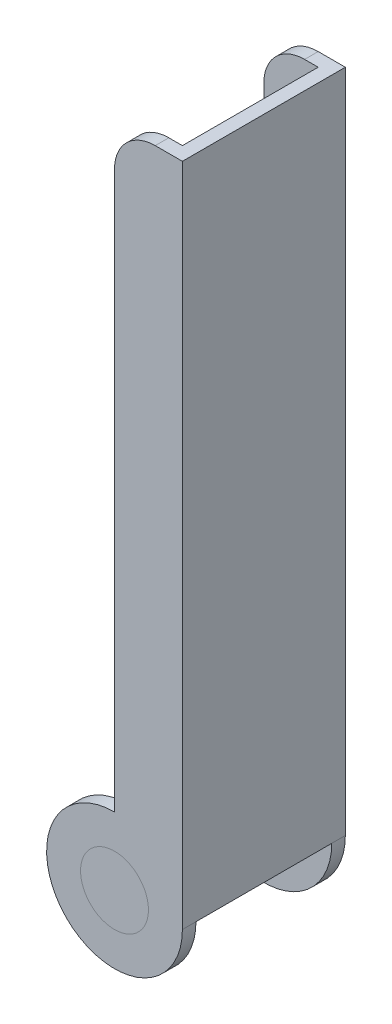
ISO-10303-21;
HEADER;
FILE_DESCRIPTION(('STEP AP214'),'2;1');
FILE_NAME('part.step','',(''),(''),'','','');
FILE_SCHEMA(('AUTOMOTIVE_DESIGN { 1 0 10303 214 1 1 1 1 }'));
ENDSEC;
DATA;
#1=APPLICATION_CONTEXT('core data for automotive mechanical design processes');
#2=APPLICATION_PROTOCOL_DEFINITION('international standard','automotive_design',2000,#1);
#3=PRODUCT_CONTEXT('',#1,'mechanical');
#4=PRODUCT('Part','Part','',(#3));
#5=PRODUCT_RELATED_PRODUCT_CATEGORY('part','',(#4));
#6=PRODUCT_DEFINITION_FORMATION('','',#4);
#7=PRODUCT_DEFINITION_CONTEXT('part definition',#1,'design');
#8=PRODUCT_DEFINITION('design','',#6,#7);
#9=PRODUCT_DEFINITION_SHAPE('','',#8);
#10=(LENGTH_UNIT() NAMED_UNIT(*) SI_UNIT(.MILLI.,.METRE.));
#11=(NAMED_UNIT(*) PLANE_ANGLE_UNIT() SI_UNIT($,.RADIAN.));
#12=(NAMED_UNIT(*) SI_UNIT($,.STERADIAN.) SOLID_ANGLE_UNIT());
#13=UNCERTAINTY_MEASURE_WITH_UNIT(LENGTH_MEASURE(1.E-05),#10,'distance_accuracy_value','');
#14=(GEOMETRIC_REPRESENTATION_CONTEXT(3) GLOBAL_UNCERTAINTY_ASSIGNED_CONTEXT((#13)) GLOBAL_UNIT_ASSIGNED_CONTEXT((#10,
#11,#12)) REPRESENTATION_CONTEXT('',''));
#15=CARTESIAN_POINT('',(0.,0.,0.));
#16=DIRECTION('',(0.,0.,1.));
#17=DIRECTION('',(1.,0.,0.));
#18=AXIS2_PLACEMENT_3D('',#15,#16,#17);
#19=CARTESIAN_POINT('',(0.,0.,12.));
#20=DIRECTION('',(0.,0.,-1.));
#21=DIRECTION('',(-1.,0.,0.));
#22=AXIS2_PLACEMENT_3D('',#19,#20,#21);
#23=CYLINDRICAL_SURFACE('',#22,2.5);
#24=CARTESIAN_POINT('',(0.,0.,12.));
#25=DIRECTION('',(0.,0.,1.));
#26=DIRECTION('',(1.,0.,0.));
#27=AXIS2_PLACEMENT_3D('',#24,#25,#26);
#28=CIRCLE('',#27,2.5);
#29=CARTESIAN_POINT('',(2.5,0.,12.));
#30=VERTEX_POINT('',#29);
#31=EDGE_CURVE('E11',#30,#30,#28,.T.);
#32=ORIENTED_EDGE('',*,*,#31,.F.);
#33=EDGE_LOOP('',(#32));
#34=FACE_BOUND('',#33,.T.);
#35=CARTESIAN_POINT('',(0.,0.,0.));
#36=DIRECTION('',(0.,0.,1.));
#37=DIRECTION('',(1.,0.,0.));
#38=AXIS2_PLACEMENT_3D('',#35,#36,#37);
#39=CIRCLE('',#38,2.5);
#40=CARTESIAN_POINT('',(2.5,0.,0.));
#41=VERTEX_POINT('',#40);
#42=EDGE_CURVE('E60',#41,#41,#39,.T.);
#43=ORIENTED_EDGE('',*,*,#42,.T.);
#44=EDGE_LOOP('',(#43));
#45=FACE_BOUND('',#44,.T.);
#46=ADVANCED_FACE('F53',(#34,#45),#23,.T.);
#47=CARTESIAN_POINT('',(0.,0.,12.));
#48=DIRECTION('',(0.,0.,1.));
#49=DIRECTION('',(1.,0.,0.));
#50=AXIS2_PLACEMENT_3D('',#47,#48,#49);
#51=PLANE('',#50);
#52=ORIENTED_EDGE('',*,*,#31,.T.);
#53=EDGE_LOOP('',(#52));
#54=FACE_BOUND('',#53,.T.);
#55=ADVANCED_FACE('F69',(#54),#51,.T.);
#56=CARTESIAN_POINT('',(0.,0.,0.));
#57=DIRECTION('',(0.,0.,1.));
#58=DIRECTION('',(1.,0.,0.));
#59=AXIS2_PLACEMENT_3D('',#56,#57,#58);
#60=PLANE('',#59);
#61=ORIENTED_EDGE('',*,*,#42,.F.);
#62=EDGE_LOOP('',(#61));
#63=FACE_BOUND('',#62,.T.);
#64=ADVANCED_FACE('F70',(#63),#60,.F.);
#65=CLOSED_SHELL('',(#46,#55,#64));
#66=MANIFOLD_SOLID_BREP('B2',#65);
#67=CARTESIAN_POINT('',(4.00000000000001,0.,12.));
#68=DIRECTION('',(1.,0.,0.));
#69=DIRECTION('',(0.,1.,0.));
#70=AXIS2_PLACEMENT_3D('',#67,#68,#69);
#71=PLANE('',#70);
#72=DIRECTION('',(0.,-1.,0.));
#73=VECTOR('',#72,1.);
#74=CARTESIAN_POINT('',(4.00000000000001,0.,11.));
#75=LINE('',#74,#73);
#76=CARTESIAN_POINT('',(4.,49.,11.));
#77=VERTEX_POINT('',#76);
#78=CARTESIAN_POINT('',(4.00000000000001,2.99999999999999,11.));
#79=VERTEX_POINT('',#78);
#80=EDGE_CURVE('E218',#77,#79,#75,.T.);
#81=ORIENTED_EDGE('',*,*,#80,.F.);
#82=DIRECTION('',(0.,0.,-1.));
#83=VECTOR('',#82,1.);
#84=CARTESIAN_POINT('',(4.,49.,12.));
#85=LINE('',#84,#83);
#86=CARTESIAN_POINT('',(4.,49.,1.));
#87=VERTEX_POINT('',#86);
#88=EDGE_CURVE('E283',#77,#87,#85,.T.);
#89=ORIENTED_EDGE('',*,*,#88,.T.);
#90=DIRECTION('',(0.,-1.,0.));
#91=VECTOR('',#90,1.);
#92=CARTESIAN_POINT('',(4.00000000000001,0.,1.));
#93=LINE('',#92,#91);
#94=CARTESIAN_POINT('',(4.00000000000001,2.99999999999999,1.));
#95=VERTEX_POINT('',#94);
#96=EDGE_CURVE('E237',#87,#95,#93,.T.);
#97=ORIENTED_EDGE('',*,*,#96,.T.);
#98=DIRECTION('',(0.,0.,-1.));
#99=VECTOR('',#98,1.);
#100=CARTESIAN_POINT('',(4.00000000000001,2.99999999999999,12.));
#101=LINE('',#100,#99);
#102=EDGE_CURVE('E275',#79,#95,#101,.T.);
#103=ORIENTED_EDGE('',*,*,#102,.F.);
#104=EDGE_LOOP('',(#81,#89,#97,#103));
#105=FACE_BOUND('',#104,.T.);
#106=ADVANCED_FACE('F94',(#105),#71,.F.);
#107=CARTESIAN_POINT('',(0.,0.,12.));
#108=DIRECTION('',(0.,0.,-1.));
#109=DIRECTION('',(-1.,0.,0.));
#110=AXIS2_PLACEMENT_3D('',#107,#108,#109);
#111=CYLINDRICAL_SURFACE('',#110,5.);
#112=DIRECTION('',(0.,0.,-1.));
#113=VECTOR('',#112,1.);
#114=CARTESIAN_POINT('',(5.,0.,12.));
#115=LINE('',#114,#113);
#116=CARTESIAN_POINT('',(5.,0.,11.));
#117=VERTEX_POINT('',#116);
#118=CARTESIAN_POINT('',(5.,0.,1.));
#119=VERTEX_POINT('',#118);
#120=EDGE_CURVE('E289',#117,#119,#115,.T.);
#121=ORIENTED_EDGE('',*,*,#120,.F.);
#122=CARTESIAN_POINT('',(0.,0.,11.));
#123=DIRECTION('',(0.,0.,1.));
#124=DIRECTION('',(1.,0.,0.));
#125=AXIS2_PLACEMENT_3D('',#122,#123,#124);
#126=CIRCLE('',#125,5.);
#127=EDGE_CURVE('E219',#117,#79,#126,.T.);
#128=ORIENTED_EDGE('',*,*,#127,.T.);
#129=ORIENTED_EDGE('',*,*,#102,.T.);
#130=CARTESIAN_POINT('',(0.,0.,1.));
#131=DIRECTION('',(0.,0.,1.));
#132=DIRECTION('',(1.,0.,0.));
#133=AXIS2_PLACEMENT_3D('',#130,#131,#132);
#134=CIRCLE('',#133,5.);
#135=EDGE_CURVE('E240',#119,#95,#134,.T.);
#136=ORIENTED_EDGE('',*,*,#135,.F.);
#137=EDGE_LOOP('',(#121,#128,#129,#136));
#138=FACE_BOUND('',#137,.T.);
#139=ADVANCED_FACE('F332',(#138),#111,.F.);
#140=CARTESIAN_POINT('',(5.,0.,12.));
#141=DIRECTION('',(-1.,0.,0.));
#142=DIRECTION('',(0.,0.,1.));
#143=AXIS2_PLACEMENT_3D('',#140,#141,#142);
#144=PLANE('',#143);
#145=DIRECTION('',(0.,1.,0.));
#146=VECTOR('',#145,1.);
#147=CARTESIAN_POINT('',(5.,0.,0.));
#148=LINE('',#147,#146);
#149=CARTESIAN_POINT('',(5.,0.,0.));
#150=VERTEX_POINT('',#149);
#151=CARTESIAN_POINT('',(5.,49.,0.));
#152=VERTEX_POINT('',#151);
#153=EDGE_CURVE('E272',#150,#152,#148,.T.);
#154=ORIENTED_EDGE('',*,*,#153,.T.);
#155=DIRECTION('',(0.,0.,-1.));
#156=VECTOR('',#155,1.);
#157=CARTESIAN_POINT('',(5.,49.,12.));
#158=LINE('',#157,#156);
#159=CARTESIAN_POINT('',(5.,49.,12.));
#160=VERTEX_POINT('',#159);
#161=EDGE_CURVE('E281',#160,#152,#158,.T.);
#162=ORIENTED_EDGE('',*,*,#161,.F.);
#163=DIRECTION('',(0.,1.,0.));
#164=VECTOR('',#163,1.);
#165=CARTESIAN_POINT('',(5.,0.,12.));
#166=LINE('',#165,#164);
#167=CARTESIAN_POINT('',(5.,0.,12.));
#168=VERTEX_POINT('',#167);
#169=EDGE_CURVE('E264',#168,#160,#166,.T.);
#170=ORIENTED_EDGE('',*,*,#169,.F.);
#171=EDGE_CURVE('E200',#168,#117,#115,.T.);
#172=ORIENTED_EDGE('',*,*,#171,.T.);
#173=ORIENTED_EDGE('',*,*,#120,.T.);
#174=EDGE_CURVE('E262',#119,#150,#115,.T.);
#175=ORIENTED_EDGE('',*,*,#174,.T.);
#176=EDGE_LOOP('',(#154,#162,#170,#172,#173,#175));
#177=FACE_BOUND('',#176,.T.);
#178=ADVANCED_FACE('F337',(#177),#144,.F.);
#179=CARTESIAN_POINT('',(0.,49.,12.));
#180=DIRECTION('',(0.,1.,0.));
#181=DIRECTION('',(0.,0.,1.));
#182=AXIS2_PLACEMENT_3D('',#179,#180,#181);
#183=PLANE('',#182);
#184=DIRECTION('',(1.,0.,0.));
#185=VECTOR('',#184,1.);
#186=CARTESIAN_POINT('',(0.,49.,11.));
#187=LINE('',#186,#185);
#188=CARTESIAN_POINT('',(3.,49.,11.));
#189=VERTEX_POINT('',#188);
#190=EDGE_CURVE('E221',#189,#77,#187,.T.);
#191=ORIENTED_EDGE('',*,*,#190,.F.);
#192=DIRECTION('',(0.,0.,-1.));
#193=VECTOR('',#192,1.);
#194=CARTESIAN_POINT('',(3.,49.,12.));
#195=LINE('',#194,#193);
#196=CARTESIAN_POINT('',(3.,49.,12.));
#197=VERTEX_POINT('',#196);
#198=EDGE_CURVE('E302',#189,#197,#195,.F.);
#199=ORIENTED_EDGE('',*,*,#198,.T.);
#200=DIRECTION('',(1.,0.,0.));
#201=VECTOR('',#200,1.);
#202=CARTESIAN_POINT('',(0.,49.,12.));
#203=LINE('',#202,#201);
#204=EDGE_CURVE('E268',#197,#160,#203,.T.);
#205=ORIENTED_EDGE('',*,*,#204,.T.);
#206=ORIENTED_EDGE('',*,*,#161,.T.);
#207=DIRECTION('',(1.,0.,0.));
#208=VECTOR('',#207,1.);
#209=CARTESIAN_POINT('',(0.,49.,0.));
#210=LINE('',#209,#208);
#211=CARTESIAN_POINT('',(3.,49.,0.));
#212=VERTEX_POINT('',#211);
#213=EDGE_CURVE('E267',#212,#152,#210,.T.);
#214=ORIENTED_EDGE('',*,*,#213,.F.);
#215=DIRECTION('',(0.,0.,-1.));
#216=VECTOR('',#215,1.);
#217=CARTESIAN_POINT('',(3.,49.,12.));
#218=LINE('',#217,#216);
#219=CARTESIAN_POINT('',(3.,49.,1.));
#220=VERTEX_POINT('',#219);
#221=EDGE_CURVE('E297',#212,#220,#218,.F.);
#222=ORIENTED_EDGE('',*,*,#221,.T.);
#223=DIRECTION('',(1.,0.,0.));
#224=VECTOR('',#223,1.);
#225=CARTESIAN_POINT('',(0.,49.,1.));
#226=LINE('',#225,#224);
#227=EDGE_CURVE('E243',#220,#87,#226,.T.);
#228=ORIENTED_EDGE('',*,*,#227,.T.);
#229=ORIENTED_EDGE('',*,*,#88,.F.);
#230=EDGE_LOOP('',(#191,#199,#205,#206,#214,#222,#228,#229));
#231=FACE_BOUND('',#230,.T.);
#232=ADVANCED_FACE('F318',(#231),#183,.T.);
#233=CARTESIAN_POINT('',(0.,0.,12.));
#234=DIRECTION('',(0.,0.,1.));
#235=DIRECTION('',(1.,0.,0.));
#236=AXIS2_PLACEMENT_3D('',#233,#234,#235);
#237=PLANE('',#236);
#238=ORIENTED_EDGE('',*,*,#204,.F.);
#239=CARTESIAN_POINT('',(3.,46.,12.));
#240=DIRECTION('',(0.,0.,1.));
#241=DIRECTION('',(1.,0.,0.));
#242=AXIS2_PLACEMENT_3D('',#239,#240,#241);
#243=CIRCLE('',#242,3.);
#244=CARTESIAN_POINT('',(0.,46.,12.));
#245=VERTEX_POINT('',#244);
#246=EDGE_CURVE('E207',#197,#245,#243,.T.);
#247=ORIENTED_EDGE('',*,*,#246,.T.);
#248=DIRECTION('',(0.,1.,0.));
#249=VECTOR('',#248,1.);
#250=CARTESIAN_POINT('',(0.,0.,12.));
#251=LINE('',#250,#249);
#252=CARTESIAN_POINT('',(0.,5.,12.));
#253=VERTEX_POINT('',#252);
#254=EDGE_CURVE('E181',#253,#245,#251,.T.);
#255=ORIENTED_EDGE('',*,*,#254,.F.);
#256=CARTESIAN_POINT('',(0.,0.,12.));
#257=DIRECTION('',(0.,0.,1.));
#258=DIRECTION('',(1.,0.,0.));
#259=AXIS2_PLACEMENT_3D('',#256,#257,#258);
#260=CIRCLE('',#259,5.);
#261=EDGE_CURVE('E198',#253,#168,#260,.T.);
#262=ORIENTED_EDGE('',*,*,#261,.T.);
#263=ORIENTED_EDGE('',*,*,#169,.T.);
#264=EDGE_LOOP('',(#238,#247,#255,#262,#263));
#265=FACE_BOUND('',#264,.T.);
#266=CARTESIAN_POINT('',(0.,0.,12.));
#267=DIRECTION('',(0.,0.,1.));
#268=DIRECTION('',(1.,0.,0.));
#269=AXIS2_PLACEMENT_3D('',#266,#267,#268);
#270=CIRCLE('',#269,2.5);
#271=CARTESIAN_POINT('',(2.5,0.,12.));
#272=VERTEX_POINT('',#271);
#273=EDGE_CURVE('E195',#272,#272,#270,.T.);
#274=ORIENTED_EDGE('',*,*,#273,.F.);
#275=EDGE_LOOP('',(#274));
#276=FACE_BOUND('',#275,.T.);
#277=ADVANCED_FACE('F206',(#265,#276),#237,.T.);
#278=CARTESIAN_POINT('',(0.,0.,0.));
#279=DIRECTION('',(0.,0.,1.));
#280=DIRECTION('',(1.,0.,0.));
#281=AXIS2_PLACEMENT_3D('',#278,#279,#280);
#282=PLANE('',#281);
#283=DIRECTION('',(0.,1.,0.));
#284=VECTOR('',#283,1.);
#285=CARTESIAN_POINT('',(0.,0.,0.));
#286=LINE('',#285,#284);
#287=CARTESIAN_POINT('',(0.,5.,0.));
#288=VERTEX_POINT('',#287);
#289=CARTESIAN_POINT('',(0.,46.,0.));
#290=VERTEX_POINT('',#289);
#291=EDGE_CURVE('E255',#288,#290,#286,.T.);
#292=ORIENTED_EDGE('',*,*,#291,.T.);
#293=CARTESIAN_POINT('',(3.,46.,0.));
#294=DIRECTION('',(0.,0.,1.));
#295=DIRECTION('',(1.,0.,0.));
#296=AXIS2_PLACEMENT_3D('',#293,#294,#295);
#297=CIRCLE('',#296,3.);
#298=EDGE_CURVE('E103',#290,#212,#297,.F.);
#299=ORIENTED_EDGE('',*,*,#298,.T.);
#300=ORIENTED_EDGE('',*,*,#213,.T.);
#301=ORIENTED_EDGE('',*,*,#153,.F.);
#302=CARTESIAN_POINT('',(0.,0.,0.));
#303=DIRECTION('',(0.,0.,1.));
#304=DIRECTION('',(1.,0.,0.));
#305=AXIS2_PLACEMENT_3D('',#302,#303,#304);
#306=CIRCLE('',#305,5.);
#307=EDGE_CURVE('E192',#288,#150,#306,.T.);
#308=ORIENTED_EDGE('',*,*,#307,.F.);
#309=EDGE_LOOP('',(#292,#299,#300,#301,#308));
#310=FACE_BOUND('',#309,.T.);
#311=CARTESIAN_POINT('',(0.,0.,0.));
#312=DIRECTION('',(0.,0.,1.));
#313=DIRECTION('',(1.,0.,0.));
#314=AXIS2_PLACEMENT_3D('',#311,#312,#313);
#315=CIRCLE('',#314,2.5);
#316=CARTESIAN_POINT('',(2.5,0.,0.));
#317=VERTEX_POINT('',#316);
#318=EDGE_CURVE('E256',#317,#317,#315,.T.);
#319=ORIENTED_EDGE('',*,*,#318,.T.);
#320=EDGE_LOOP('',(#319));
#321=FACE_BOUND('',#320,.T.);
#322=ADVANCED_FACE('F313',(#310,#321),#282,.F.);
#323=CARTESIAN_POINT('',(0.,0.,1.));
#324=DIRECTION('',(0.,0.,-1.));
#325=DIRECTION('',(-1.,0.,0.));
#326=AXIS2_PLACEMENT_3D('',#323,#324,#325);
#327=CYLINDRICAL_SURFACE('',#326,5.);
#328=ORIENTED_EDGE('',*,*,#174,.F.);
#329=CARTESIAN_POINT('',(0.,5.,1.));
#330=VERTEX_POINT('',#329);
#331=EDGE_CURVE('E235',#330,#119,#134,.T.);
#332=ORIENTED_EDGE('',*,*,#331,.F.);
#333=DIRECTION('',(0.,0.,-1.));
#334=VECTOR('',#333,1.);
#335=CARTESIAN_POINT('',(0.,5.,1.));
#336=LINE('',#335,#334);
#337=EDGE_CURVE('E253',#330,#288,#336,.T.);
#338=ORIENTED_EDGE('',*,*,#337,.T.);
#339=ORIENTED_EDGE('',*,*,#307,.T.);
#340=EDGE_LOOP('',(#328,#332,#338,#339));
#341=FACE_BOUND('',#340,.T.);
#342=ADVANCED_FACE('F336',(#341),#327,.T.);
#343=CARTESIAN_POINT('',(0.,0.,1.));
#344=DIRECTION('',(-1.,0.,0.));
#345=DIRECTION('',(0.,0.,1.));
#346=AXIS2_PLACEMENT_3D('',#343,#344,#345);
#347=PLANE('',#346);
#348=DIRECTION('',(0.,1.,0.));
#349=VECTOR('',#348,1.);
#350=CARTESIAN_POINT('',(0.,0.,1.));
#351=LINE('',#350,#349);
#352=CARTESIAN_POINT('',(0.,46.,1.));
#353=VERTEX_POINT('',#352);
#354=EDGE_CURVE('E245',#330,#353,#351,.T.);
#355=ORIENTED_EDGE('',*,*,#354,.T.);
#356=DIRECTION('',(0.,0.,-1.));
#357=VECTOR('',#356,1.);
#358=CARTESIAN_POINT('',(0.,46.,1.));
#359=LINE('',#358,#357);
#360=EDGE_CURVE('E308',#353,#290,#359,.T.);
#361=ORIENTED_EDGE('',*,*,#360,.T.);
#362=ORIENTED_EDGE('',*,*,#291,.F.);
#363=ORIENTED_EDGE('',*,*,#337,.F.);
#364=EDGE_LOOP('',(#355,#361,#362,#363));
#365=FACE_BOUND('',#364,.T.);
#366=ADVANCED_FACE('F321',(#365),#347,.T.);
#367=CARTESIAN_POINT('',(0.,0.,1.));
#368=DIRECTION('',(0.,0.,-1.));
#369=DIRECTION('',(-1.,0.,0.));
#370=AXIS2_PLACEMENT_3D('',#367,#368,#369);
#371=CYLINDRICAL_SURFACE('',#370,2.5);
#372=CARTESIAN_POINT('',(0.,0.,1.));
#373=DIRECTION('',(0.,0.,1.));
#374=DIRECTION('',(1.,0.,0.));
#375=AXIS2_PLACEMENT_3D('',#372,#373,#374);
#376=CIRCLE('',#375,2.5);
#377=CARTESIAN_POINT('',(2.5,0.,1.));
#378=VERTEX_POINT('',#377);
#379=EDGE_CURVE('E250',#378,#378,#376,.T.);
#380=ORIENTED_EDGE('',*,*,#379,.T.);
#381=EDGE_LOOP('',(#380));
#382=FACE_BOUND('',#381,.T.);
#383=ORIENTED_EDGE('',*,*,#318,.F.);
#384=EDGE_LOOP('',(#383));
#385=FACE_BOUND('',#384,.T.);
#386=ADVANCED_FACE('F382',(#382,#385),#371,.F.);
#387=CARTESIAN_POINT('',(0.,0.,1.));
#388=DIRECTION('',(0.,0.,1.));
#389=DIRECTION('',(1.,0.,0.));
#390=AXIS2_PLACEMENT_3D('',#387,#388,#389);
#391=PLANE('',#390);
#392=ORIENTED_EDGE('',*,*,#227,.F.);
#393=CARTESIAN_POINT('',(3.,46.,1.));
#394=DIRECTION('',(0.,0.,1.));
#395=DIRECTION('',(1.,0.,0.));
#396=AXIS2_PLACEMENT_3D('',#393,#394,#395);
#397=CIRCLE('',#396,3.);
#398=EDGE_CURVE('E55',#220,#353,#397,.T.);
#399=ORIENTED_EDGE('',*,*,#398,.T.);
#400=ORIENTED_EDGE('',*,*,#354,.F.);
#401=ORIENTED_EDGE('',*,*,#331,.T.);
#402=ORIENTED_EDGE('',*,*,#135,.T.);
#403=ORIENTED_EDGE('',*,*,#96,.F.);
#404=EDGE_LOOP('',(#392,#399,#400,#401,#402,#403));
#405=FACE_BOUND('',#404,.T.);
#406=ORIENTED_EDGE('',*,*,#379,.F.);
#407=EDGE_LOOP('',(#406));
#408=FACE_BOUND('',#407,.T.);
#409=ADVANCED_FACE('F323',(#405,#408),#391,.T.);
#410=CARTESIAN_POINT('',(0.,0.,12.));
#411=DIRECTION('',(0.,0.,-1.));
#412=DIRECTION('',(-1.,0.,0.));
#413=AXIS2_PLACEMENT_3D('',#410,#411,#412);
#414=CYLINDRICAL_SURFACE('',#413,5.);
#415=ORIENTED_EDGE('',*,*,#171,.F.);
#416=ORIENTED_EDGE('',*,*,#261,.F.);
#417=DIRECTION('',(0.,0.,-1.));
#418=VECTOR('',#417,1.);
#419=CARTESIAN_POINT('',(0.,5.,12.));
#420=LINE('',#419,#418);
#421=CARTESIAN_POINT('',(0.,5.,11.));
#422=VERTEX_POINT('',#421);
#423=EDGE_CURVE('E178',#253,#422,#420,.T.);
#424=ORIENTED_EDGE('',*,*,#423,.T.);
#425=EDGE_CURVE('E216',#422,#117,#126,.T.);
#426=ORIENTED_EDGE('',*,*,#425,.T.);
#427=EDGE_LOOP('',(#415,#416,#424,#426));
#428=FACE_BOUND('',#427,.T.);
#429=ADVANCED_FACE('F197',(#428),#414,.T.);
#430=CARTESIAN_POINT('',(0.,0.,12.));
#431=DIRECTION('',(-1.,0.,0.));
#432=DIRECTION('',(0.,0.,1.));
#433=AXIS2_PLACEMENT_3D('',#430,#431,#432);
#434=PLANE('',#433);
#435=ORIENTED_EDGE('',*,*,#254,.T.);
#436=DIRECTION('',(0.,0.,-1.));
#437=VECTOR('',#436,1.);
#438=CARTESIAN_POINT('',(0.,46.,12.));
#439=LINE('',#438,#437);
#440=CARTESIAN_POINT('',(0.,46.,11.));
#441=VERTEX_POINT('',#440);
#442=EDGE_CURVE('E295',#245,#441,#439,.T.);
#443=ORIENTED_EDGE('',*,*,#442,.T.);
#444=DIRECTION('',(0.,1.,0.));
#445=VECTOR('',#444,1.);
#446=CARTESIAN_POINT('',(0.,0.,11.));
#447=LINE('',#446,#445);
#448=EDGE_CURVE('E188',#422,#441,#447,.T.);
#449=ORIENTED_EDGE('',*,*,#448,.F.);
#450=ORIENTED_EDGE('',*,*,#423,.F.);
#451=EDGE_LOOP('',(#435,#443,#449,#450));
#452=FACE_BOUND('',#451,.T.);
#453=ADVANCED_FACE('F176',(#452),#434,.T.);
#454=CARTESIAN_POINT('',(0.,0.,12.));
#455=DIRECTION('',(0.,0.,-1.));
#456=DIRECTION('',(-1.,0.,0.));
#457=AXIS2_PLACEMENT_3D('',#454,#455,#456);
#458=CYLINDRICAL_SURFACE('',#457,2.5);
#459=ORIENTED_EDGE('',*,*,#273,.T.);
#460=EDGE_LOOP('',(#459));
#461=FACE_BOUND('',#460,.T.);
#462=CARTESIAN_POINT('',(0.,0.,11.));
#463=DIRECTION('',(0.,0.,1.));
#464=DIRECTION('',(1.,0.,0.));
#465=AXIS2_PLACEMENT_3D('',#462,#463,#464);
#466=CIRCLE('',#465,2.5);
#467=CARTESIAN_POINT('',(2.5,0.,11.));
#468=VERTEX_POINT('',#467);
#469=EDGE_CURVE('E201',#468,#468,#466,.T.);
#470=ORIENTED_EDGE('',*,*,#469,.F.);
#471=EDGE_LOOP('',(#470));
#472=FACE_BOUND('',#471,.T.);
#473=ADVANCED_FACE('F369',(#461,#472),#458,.F.);
#474=CARTESIAN_POINT('',(0.,0.,11.));
#475=DIRECTION('',(0.,0.,1.));
#476=DIRECTION('',(1.,0.,0.));
#477=AXIS2_PLACEMENT_3D('',#474,#475,#476);
#478=PLANE('',#477);
#479=ORIENTED_EDGE('',*,*,#448,.T.);
#480=CARTESIAN_POINT('',(3.,46.,11.));
#481=DIRECTION('',(0.,0.,1.));
#482=DIRECTION('',(1.,0.,0.));
#483=AXIS2_PLACEMENT_3D('',#480,#481,#482);
#484=CIRCLE('',#483,3.);
#485=EDGE_CURVE('E293',#441,#189,#484,.F.);
#486=ORIENTED_EDGE('',*,*,#485,.T.);
#487=ORIENTED_EDGE('',*,*,#190,.T.);
#488=ORIENTED_EDGE('',*,*,#80,.T.);
#489=ORIENTED_EDGE('',*,*,#127,.F.);
#490=ORIENTED_EDGE('',*,*,#425,.F.);
#491=EDGE_LOOP('',(#479,#486,#487,#488,#489,#490));
#492=FACE_BOUND('',#491,.T.);
#493=ORIENTED_EDGE('',*,*,#469,.T.);
#494=EDGE_LOOP('',(#493));
#495=FACE_BOUND('',#494,.T.);
#496=ADVANCED_FACE('F341',(#492,#495),#478,.F.);
#497=CARTESIAN_POINT('',(3.,46.,12.));
#498=DIRECTION('',(0.,0.,-1.));
#499=DIRECTION('',(-1.,0.,0.));
#500=AXIS2_PLACEMENT_3D('',#497,#498,#499);
#501=CYLINDRICAL_SURFACE('',#500,3.);
#502=ORIENTED_EDGE('',*,*,#246,.F.);
#503=ORIENTED_EDGE('',*,*,#198,.F.);
#504=ORIENTED_EDGE('',*,*,#485,.F.);
#505=ORIENTED_EDGE('',*,*,#442,.F.);
#506=EDGE_LOOP('',(#502,#503,#504,#505));
#507=FACE_BOUND('',#506,.T.);
#508=ADVANCED_FACE('F343',(#507),#501,.T.);
#509=CARTESIAN_POINT('',(3.,46.,1.));
#510=DIRECTION('',(0.,0.,-1.));
#511=DIRECTION('',(-1.,0.,0.));
#512=AXIS2_PLACEMENT_3D('',#509,#510,#511);
#513=CYLINDRICAL_SURFACE('',#512,3.);
#514=ORIENTED_EDGE('',*,*,#398,.F.);
#515=ORIENTED_EDGE('',*,*,#221,.F.);
#516=ORIENTED_EDGE('',*,*,#298,.F.);
#517=ORIENTED_EDGE('',*,*,#360,.F.);
#518=EDGE_LOOP('',(#514,#515,#516,#517));
#519=FACE_BOUND('',#518,.T.);
#520=ADVANCED_FACE('F96',(#519),#513,.T.);
#521=CLOSED_SHELL('',(#106,#139,#178,#232,#277,#322,#342,#366,#386,#409,#429,#453,#473,#496,
#508,#520));
#522=MANIFOLD_SOLID_BREP('B6',#521);
#523=ADVANCED_BREP_SHAPE_REPRESENTATION('',(#18,#66,#522),#14);
#524=SHAPE_DEFINITION_REPRESENTATION(#9,#523);
ENDSEC;
END-ISO-10303-21;
